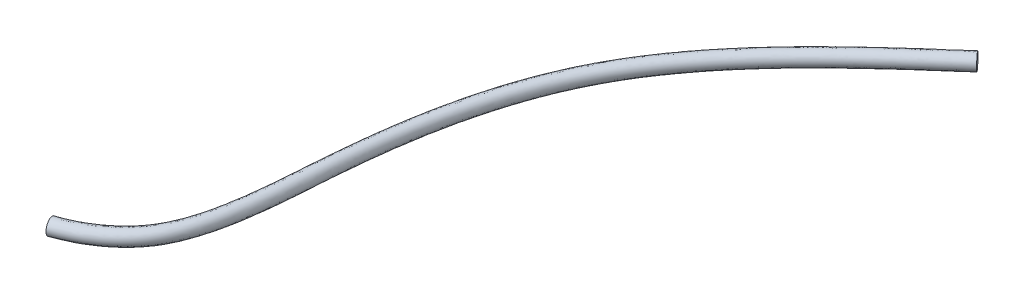
ISO-10303-21;
HEADER;
FILE_DESCRIPTION(('STEP AP214'),'2;1');
FILE_NAME('part.step','',(''),(''),'','','');
FILE_SCHEMA(('AUTOMOTIVE_DESIGN { 1 0 10303 214 1 1 1 1 }'));
ENDSEC;
DATA;
#1=APPLICATION_CONTEXT('core data for automotive mechanical design processes');
#2=APPLICATION_PROTOCOL_DEFINITION('international standard','automotive_design',2000,#1);
#3=PRODUCT_CONTEXT('',#1,'mechanical');
#4=PRODUCT('Part','Part','',(#3));
#5=PRODUCT_RELATED_PRODUCT_CATEGORY('part','',(#4));
#6=PRODUCT_DEFINITION_FORMATION('','',#4);
#7=PRODUCT_DEFINITION_CONTEXT('part definition',#1,'design');
#8=PRODUCT_DEFINITION('design','',#6,#7);
#9=PRODUCT_DEFINITION_SHAPE('','',#8);
#10=(LENGTH_UNIT() NAMED_UNIT(*) SI_UNIT(.MILLI.,.METRE.));
#11=(NAMED_UNIT(*) PLANE_ANGLE_UNIT() SI_UNIT($,.RADIAN.));
#12=(NAMED_UNIT(*) SI_UNIT($,.STERADIAN.) SOLID_ANGLE_UNIT());
#13=UNCERTAINTY_MEASURE_WITH_UNIT(LENGTH_MEASURE(1.E-05),#10,'distance_accuracy_value','');
#14=(GEOMETRIC_REPRESENTATION_CONTEXT(3) GLOBAL_UNCERTAINTY_ASSIGNED_CONTEXT((#13)) GLOBAL_UNIT_ASSIGNED_CONTEXT((#10,
#11,#12)) REPRESENTATION_CONTEXT('',''));
#15=CARTESIAN_POINT('',(0.,0.,0.));
#16=DIRECTION('',(0.,0.,1.));
#17=DIRECTION('',(1.,0.,0.));
#18=AXIS2_PLACEMENT_3D('',#15,#16,#17);
#19=CARTESIAN_POINT('',(0.,0.,0.));
#20=DIRECTION('',(0.947625352894071,0.,-0.319384079992079));
#21=DIRECTION('',(-0.319384079992079,0.,-0.947625352894071));
#22=AXIS2_PLACEMENT_3D('',#19,#20,#21);
#23=PLANE('',#22);
#24=CARTESIAN_POINT('',(0.,0.,0.));
#25=DIRECTION('',(0.947625352894071,0.,-0.319384079992079));
#26=DIRECTION('',(-0.319384079992079,0.,-0.947625352894071));
#27=AXIS2_PLACEMENT_3D('',#24,#25,#26);
#28=CIRCLE('',#27,2.54);
#29=CARTESIAN_POINT('',(-0.811235563179881,0.,-2.40696839635094));
#30=VERTEX_POINT('',#29);
#31=EDGE_CURVE('E45',#30,#30,#28,.T.);
#32=ORIENTED_EDGE('',*,*,#31,.F.);
#33=EDGE_LOOP('',(#32));
#34=FACE_BOUND('',#33,.T.);
#35=ADVANCED_FACE('F38',(#34),#23,.F.);
#36=CARTESIAN_POINT('',(107.667173493089,0.,-203.391942640382));
#37=DIRECTION('',(0.752544739570178,0.,-0.658541126236815));
#38=DIRECTION('',(-0.658541126236815,0.,-0.752544739570178));
#39=AXIS2_PLACEMENT_3D('',#36,#37,#38);
#40=PLANE('',#39);
#41=CARTESIAN_POINT('',(107.667173493089,0.,-203.391942640382));
#42=DIRECTION('',(0.752544739570178,0.,-0.658541126236815));
#43=DIRECTION('',(-0.658541126236815,0.,-0.752544739570178));
#44=AXIS2_PLACEMENT_3D('',#41,#42,#43);
#45=CIRCLE('',#44,2.54);
#46=CARTESIAN_POINT('',(105.994479032447,0.,-205.303406278891));
#47=VERTEX_POINT('',#46);
#48=EDGE_CURVE('E12',#47,#47,#45,.T.);
#49=ORIENTED_EDGE('',*,*,#48,.T.);
#50=EDGE_LOOP('',(#49));
#51=FACE_BOUND('',#50,.T.);
#52=ADVANCED_FACE('F52',(#51),#40,.T.);
#53=CARTESIAN_POINT('',(-0.811235563179881,0.,-2.40696839635094));
#54=CARTESIAN_POINT('',(2.70615241243727,0.,-3.59245559215841));
#55=CARTESIAN_POINT('',(6.20755460309856,0.,-5.31473289978975));
#56=CARTESIAN_POINT('',(12.4719874782939,0.,-9.679744806905));
#57=CARTESIAN_POINT('',(15.2319105969181,0.,-12.3197918583195));
#58=CARTESIAN_POINT('',(20.4961563179388,0.,-19.9097479901364));
#59=CARTESIAN_POINT('',(22.2971455559364,0.,-25.6618526164698));
#60=CARTESIAN_POINT('',(25.848888021252,0.,-42.4904680328615));
#61=CARTESIAN_POINT('',(26.2631070049531,0.,-53.5435799351353));
#62=CARTESIAN_POINT('',(29.1619985178653,0.,-89.2564545715577));
#63=CARTESIAN_POINT('',(33.471097840325,0.,-114.376501464974));
#64=CARTESIAN_POINT('',(51.6528664669583,0.,-150.018753226522));
#65=CARTESIAN_POINT('',(61.363567939075,0.,-162.345045908408));
#66=CARTESIAN_POINT('',(82.8785571467374,0.,-185.038234705338));
#67=CARTESIAN_POINT('',(94.6899214354596,0.,-195.410949790709));
#68=CARTESIAN_POINT('',(105.994479032447,0.,-205.303406278891));
#69=CARTESIAN_POINT('',(-0.811235563179881,5.08,-2.40696839635094));
#70=CARTESIAN_POINT('',(2.70615241243727,5.08,-3.59245559215841));
#71=CARTESIAN_POINT('',(6.20755460309856,5.08,-5.31473289978975));
#72=CARTESIAN_POINT('',(12.4719874782939,5.08,-9.679744806905));
#73=CARTESIAN_POINT('',(15.2319105969181,5.08,-12.3197918583195));
#74=CARTESIAN_POINT('',(20.4961563179388,5.08,-19.9097479901364));
#75=CARTESIAN_POINT('',(22.2971455559364,5.08,-25.6618526164698));
#76=CARTESIAN_POINT('',(25.848888021252,5.08,-42.4904680328615));
#77=CARTESIAN_POINT('',(26.2631070049531,5.08,-53.5435799351353));
#78=CARTESIAN_POINT('',(29.1619985178653,5.08,-89.2564545715577));
#79=CARTESIAN_POINT('',(33.471097840325,5.08,-114.376501464974));
#80=CARTESIAN_POINT('',(51.6528664669583,5.08,-150.018753226522));
#81=CARTESIAN_POINT('',(61.363567939075,5.08,-162.345045908408));
#82=CARTESIAN_POINT('',(82.8785571467374,5.08,-185.038234705338));
#83=CARTESIAN_POINT('',(94.6899214354596,5.08,-195.410949790709));
#84=CARTESIAN_POINT('',(105.994479032447,5.08,-205.303406278891));
#85=CARTESIAN_POINT('',(0.811235563179881,5.08,2.40696839635094));
#86=CARTESIAN_POINT('',(4.77004347798089,5.08,1.07270668666449));
#87=CARTESIAN_POINT('',(8.6858834772259,5.08,-0.850013142066712));
#88=CARTESIAN_POINT('',(15.8020796840994,5.08,-5.80852763119387));
#89=CARTESIAN_POINT('',(19.00554346046,5.08,-8.84700984091016));
#90=CARTESIAN_POINT('',(25.2817871251867,5.08,-17.8960581967813));
#91=CARTESIAN_POINT('',(27.2040662998505,5.08,-24.3115445075576));
#92=CARTESIAN_POINT('',(30.9361893682001,5.08,-41.9948265626231));
#93=CARTESIAN_POINT('',(31.3384532428139,5.08,-53.2804091398423));
#94=CARTESIAN_POINT('',(34.1996847591564,5.08,-88.5293317013021));
#95=CARTESIAN_POINT('',(38.4743965761913,5.08,-113.005277269014));
#96=CARTESIAN_POINT('',(55.8751710080398,5.08,-147.11652331389));
#97=CARTESIAN_POINT('',(65.2644645755053,5.08,-159.076026963592));
#98=CARTESIAN_POINT('',(86.3507148411113,5.08,-181.316998301813));
#99=CARTESIAN_POINT('',(98.0405949876808,5.08,-191.592647019051));
#100=CARTESIAN_POINT('',(109.33986795373,5.08,-201.480479001874));
#101=CARTESIAN_POINT('',(0.811235563179881,0.,2.40696839635094));
#102=CARTESIAN_POINT('',(4.77004347798089,0.,1.07270668666449));
#103=CARTESIAN_POINT('',(8.6858834772259,0.,-0.850013142067153));
#104=CARTESIAN_POINT('',(15.8020796840994,0.,-5.80852763119343));
#105=CARTESIAN_POINT('',(19.0055434604634,0.,-8.84700984091016));
#106=CARTESIAN_POINT('',(25.2817871251814,0.,-17.8960581967813));
#107=CARTESIAN_POINT('',(27.2040662998452,0.,-24.3115445075576));
#108=CARTESIAN_POINT('',(30.93618936821,0.,-41.9948265626231));
#109=CARTESIAN_POINT('',(31.3384532427942,0.,-53.2804091398423));
#110=CARTESIAN_POINT('',(34.1996847591984,0.,-88.5293317013021));
#111=CARTESIAN_POINT('',(38.4743965761497,0.,-113.005277269014));
#112=CARTESIAN_POINT('',(55.8751710080661,0.,-147.11652331389));
#113=CARTESIAN_POINT('',(65.264464575559,0.,-159.076026963592));
#114=CARTESIAN_POINT('',(86.3507148410576,0.,-181.316998301813));
#115=CARTESIAN_POINT('',(98.0405949876808,0.,-191.592647019051));
#116=CARTESIAN_POINT('',(109.33986795373,0.,-201.480479001874));
#117=CARTESIAN_POINT('',(0.811235563179881,-5.08,2.40696839635094));
#118=CARTESIAN_POINT('',(4.77004347798089,-5.08,1.07270668666449));
#119=CARTESIAN_POINT('',(8.6858834772259,-5.08,-0.850013142067595));
#120=CARTESIAN_POINT('',(15.8020796840994,-5.08,-5.80852763119299));
#121=CARTESIAN_POINT('',(19.0055434604669,-5.08,-8.84700984091016));
#122=CARTESIAN_POINT('',(25.2817871251761,-5.08,-17.8960581967813));
#123=CARTESIAN_POINT('',(27.2040662998398,-5.08,-24.3115445075576));
#124=CARTESIAN_POINT('',(30.9361893682199,-5.08,-41.994826562623));
#125=CARTESIAN_POINT('',(31.3384532427745,-5.08,-53.2804091398423));
#126=CARTESIAN_POINT('',(34.1996847592405,-5.08,-88.5293317013021));
#127=CARTESIAN_POINT('',(38.4743965761081,-5.08,-113.005277269014));
#128=CARTESIAN_POINT('',(55.8751710080925,-5.08,-147.11652331389));
#129=CARTESIAN_POINT('',(65.2644645756127,-5.08,-159.076026963592));
#130=CARTESIAN_POINT('',(86.3507148410039,-5.08,-181.316998301813));
#131=CARTESIAN_POINT('',(98.0405949876808,-5.08,-191.592647019051));
#132=CARTESIAN_POINT('',(109.33986795373,-5.08,-201.480479001874));
#133=CARTESIAN_POINT('',(-0.811235563179881,-5.08,-2.40696839635094));
#134=CARTESIAN_POINT('',(2.70615241243727,-5.08,-3.59245559215841));
#135=CARTESIAN_POINT('',(6.20755460309856,-5.08,-5.31473289978975));
#136=CARTESIAN_POINT('',(12.4719874782939,-5.08,-9.679744806905));
#137=CARTESIAN_POINT('',(15.2319105969181,-5.08,-12.3197918583195));
#138=CARTESIAN_POINT('',(20.4961563179388,-5.08,-19.9097479901364));
#139=CARTESIAN_POINT('',(22.2971455559364,-5.08,-25.6618526164698));
#140=CARTESIAN_POINT('',(25.848888021252,-5.08,-42.4904680328615));
#141=CARTESIAN_POINT('',(26.2631070049531,-5.08,-53.5435799351353));
#142=CARTESIAN_POINT('',(29.1619985178653,-5.08,-89.2564545715577));
#143=CARTESIAN_POINT('',(33.471097840325,-5.08,-114.376501464974));
#144=CARTESIAN_POINT('',(51.6528664669583,-5.08,-150.018753226522));
#145=CARTESIAN_POINT('',(61.363567939075,-5.08,-162.345045908408));
#146=CARTESIAN_POINT('',(82.8785571467374,-5.08,-185.038234705338));
#147=CARTESIAN_POINT('',(94.6899214354596,-5.08,-195.410949790709));
#148=CARTESIAN_POINT('',(105.994479032447,-5.08,-205.303406278891));
#149=CARTESIAN_POINT('',(-0.811235563179881,0.,-2.40696839635094));
#150=CARTESIAN_POINT('',(2.70615241243727,0.,-3.59245559215841));
#151=CARTESIAN_POINT('',(6.20755460309856,0.,-5.31473289978975));
#152=CARTESIAN_POINT('',(12.4719874782939,0.,-9.679744806905));
#153=CARTESIAN_POINT('',(15.2319105969181,0.,-12.3197918583195));
#154=CARTESIAN_POINT('',(20.4961563179388,0.,-19.9097479901364));
#155=CARTESIAN_POINT('',(22.2971455559364,0.,-25.6618526164698));
#156=CARTESIAN_POINT('',(25.848888021252,0.,-42.4904680328615));
#157=CARTESIAN_POINT('',(26.2631070049531,0.,-53.5435799351353));
#158=CARTESIAN_POINT('',(29.1619985178653,0.,-89.2564545715577));
#159=CARTESIAN_POINT('',(33.471097840325,0.,-114.376501464974));
#160=CARTESIAN_POINT('',(51.6528664669583,0.,-150.018753226522));
#161=CARTESIAN_POINT('',(61.363567939075,0.,-162.345045908408));
#162=CARTESIAN_POINT('',(82.8785571467374,0.,-185.038234705338));
#163=CARTESIAN_POINT('',(94.6899214354596,0.,-195.410949790709));
#164=CARTESIAN_POINT('',(105.994479032447,0.,-205.303406278891));
#165=(BOUNDED_SURFACE() B_SPLINE_SURFACE(3,3,((#53,#54,#55,#56,#57,#58,#59,#60,#61,#62,#63,#64,
#65,#66,#67,#68),(#69,#70,#71,#72,#73,#74,#75,#76,#77,#78,#79,#80,#81,#82,#83,#84),(#85,#86,#87,
#88,#89,#90,#91,#92,#93,#94,#95,#96,#97,#98,#99,#100),(#101,#102,#103,#104,#105,#106,#107,#108,
#109,#110,#111,#112,#113,#114,#115,#116),(#117,#118,#119,#120,#121,#122,#123,#124,#125,#126,
#127,#128,#129,#130,#131,#132),(#133,#134,#135,#136,#137,#138,#139,#140,#141,#142,#143,#144,
#145,#146,#147,#148),(#149,#150,#151,#152,#153,#154,#155,#156,#157,#158,#159,#160,#161,#162,
#163,#164)),.UNSPECIFIED.,.T.,.F.,.F.) B_SPLINE_SURFACE_WITH_KNOTS((4,3,4),(4,2,2,2,2,2,2,4),
(0.,0.5,1.),(0.,0.0501985902250683,0.100397180450137,0.177005674148057,0.317730109800229,
0.618651507439043,0.809325753719521,1.),
.UNSPECIFIED.) GEOMETRIC_REPRESENTATION_ITEM() RATIONAL_B_SPLINE_SURFACE(((1.,1.,1.,1.,1.,1.,1.,
1.,1.,1.,1.,1.,1.,1.,1.,1.),(0.333333333333333,0.333333333333333,0.333333333333333,
0.333333333333333,0.333333333333333,0.333333333333333,0.333333333333333,0.333333333333333,
0.333333333333333,0.333333333333333,0.333333333333333,0.333333333333333,0.333333333333333,
0.333333333333333,0.333333333333333,0.333333333333333),(0.333333333333333,0.333333333333333,
0.333333333333333,0.333333333333333,0.333333333333333,0.333333333333333,0.333333333333333,
0.333333333333333,0.333333333333333,0.333333333333333,0.333333333333333,0.333333333333333,
0.333333333333333,0.333333333333333,0.333333333333333,0.333333333333333),(1.,1.,1.,1.,1.,1.,1.,
1.,1.,1.,1.,1.,1.,1.,1.,1.),(0.333333333333333,0.333333333333333,0.333333333333333,
0.333333333333333,0.333333333333333,0.333333333333333,0.333333333333333,0.333333333333333,
0.333333333333333,0.333333333333333,0.333333333333333,0.333333333333333,0.333333333333333,
0.333333333333333,0.333333333333333,0.333333333333333),(0.333333333333333,0.333333333333333,
0.333333333333333,0.333333333333333,0.333333333333333,0.333333333333333,0.333333333333333,
0.333333333333333,0.333333333333333,0.333333333333333,0.333333333333333,0.333333333333333,
0.333333333333333,0.333333333333333,0.333333333333333,0.333333333333333),(1.,1.,1.,1.,1.,1.,1.,
1.,1.,1.,1.,1.,1.,1.,1.,1.))) REPRESENTATION_ITEM('') SURFACE());
#166=ORIENTED_EDGE('',*,*,#48,.F.);
#167=EDGE_LOOP('',(#166));
#168=FACE_BOUND('',#167,.T.);
#169=ORIENTED_EDGE('',*,*,#31,.T.);
#170=EDGE_LOOP('',(#169));
#171=FACE_BOUND('',#170,.T.);
#172=ADVANCED_FACE('F54',(#168,#171),#165,.T.);
#173=CLOSED_SHELL('',(#35,#52,#172));
#174=MANIFOLD_SOLID_BREP('B2',#173);
#175=ADVANCED_BREP_SHAPE_REPRESENTATION('',(#18,#174),#14);
#176=SHAPE_DEFINITION_REPRESENTATION(#9,#175);
ENDSEC;
END-ISO-10303-21;
